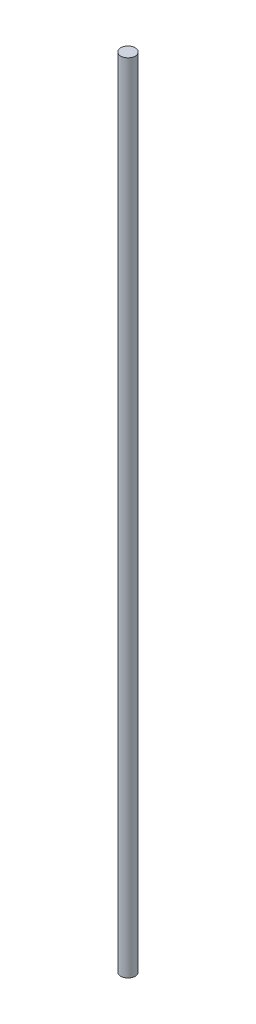
ISO-10303-21;
HEADER;
FILE_DESCRIPTION(('STEP AP214'),'2;1');
FILE_NAME('part.step','',(''),(''),'','','');
FILE_SCHEMA(('AUTOMOTIVE_DESIGN { 1 0 10303 214 1 1 1 1 }'));
ENDSEC;
DATA;
#1=APPLICATION_CONTEXT('core data for automotive mechanical design processes');
#2=APPLICATION_PROTOCOL_DEFINITION('international standard','automotive_design',2000,#1);
#3=PRODUCT_CONTEXT('',#1,'mechanical');
#4=PRODUCT('Part','Part','',(#3));
#5=PRODUCT_RELATED_PRODUCT_CATEGORY('part','',(#4));
#6=PRODUCT_DEFINITION_FORMATION('','',#4);
#7=PRODUCT_DEFINITION_CONTEXT('part definition',#1,'design');
#8=PRODUCT_DEFINITION('design','',#6,#7);
#9=PRODUCT_DEFINITION_SHAPE('','',#8);
#10=(LENGTH_UNIT() NAMED_UNIT(*) SI_UNIT(.MILLI.,.METRE.));
#11=(NAMED_UNIT(*) PLANE_ANGLE_UNIT() SI_UNIT($,.RADIAN.));
#12=(NAMED_UNIT(*) SI_UNIT($,.STERADIAN.) SOLID_ANGLE_UNIT());
#13=UNCERTAINTY_MEASURE_WITH_UNIT(LENGTH_MEASURE(1.E-05),#10,'distance_accuracy_value','');
#14=(GEOMETRIC_REPRESENTATION_CONTEXT(3) GLOBAL_UNCERTAINTY_ASSIGNED_CONTEXT((#13)) GLOBAL_UNIT_ASSIGNED_CONTEXT((#10,
#11,#12)) REPRESENTATION_CONTEXT('',''));
#15=CARTESIAN_POINT('',(0.,0.,0.));
#16=DIRECTION('',(0.,0.,1.));
#17=DIRECTION('',(1.,0.,0.));
#18=AXIS2_PLACEMENT_3D('',#15,#16,#17);
#19=CARTESIAN_POINT('',(0.,220.,0.));
#20=DIRECTION('',(0.,-1.,0.));
#21=DIRECTION('',(0.,0.,-1.));
#22=AXIS2_PLACEMENT_3D('',#19,#20,#21);
#23=CYLINDRICAL_SURFACE('',#22,2.);
#24=CARTESIAN_POINT('',(0.,220.,0.));
#25=DIRECTION('',(0.,1.,0.));
#26=DIRECTION('',(0.,0.,1.));
#27=AXIS2_PLACEMENT_3D('',#24,#25,#26);
#28=CIRCLE('',#27,2.);
#29=CARTESIAN_POINT('',(0.,220.,2.));
#30=VERTEX_POINT('',#29);
#31=EDGE_CURVE('E10',#30,#30,#28,.T.);
#32=ORIENTED_EDGE('',*,*,#31,.F.);
#33=EDGE_LOOP('',(#32));
#34=FACE_BOUND('',#33,.T.);
#35=CARTESIAN_POINT('',(0.,0.,0.));
#36=DIRECTION('',(0.,1.,0.));
#37=DIRECTION('',(0.,0.,1.));
#38=AXIS2_PLACEMENT_3D('',#35,#36,#37);
#39=CIRCLE('',#38,2.);
#40=CARTESIAN_POINT('',(0.,0.,2.));
#41=VERTEX_POINT('',#40);
#42=EDGE_CURVE('E44',#41,#41,#39,.T.);
#43=ORIENTED_EDGE('',*,*,#42,.T.);
#44=EDGE_LOOP('',(#43));
#45=FACE_BOUND('',#44,.T.);
#46=ADVANCED_FACE('F41',(#34,#45),#23,.T.);
#47=CARTESIAN_POINT('',(0.,220.,0.));
#48=DIRECTION('',(0.,1.,0.));
#49=DIRECTION('',(0.,0.,1.));
#50=AXIS2_PLACEMENT_3D('',#47,#48,#49);
#51=PLANE('',#50);
#52=ORIENTED_EDGE('',*,*,#31,.T.);
#53=EDGE_LOOP('',(#52));
#54=FACE_BOUND('',#53,.T.);
#55=ADVANCED_FACE('F58',(#54),#51,.T.);
#56=CARTESIAN_POINT('',(0.,0.,0.));
#57=DIRECTION('',(0.,1.,0.));
#58=DIRECTION('',(0.,0.,1.));
#59=AXIS2_PLACEMENT_3D('',#56,#57,#58);
#60=PLANE('',#59);
#61=ORIENTED_EDGE('',*,*,#42,.F.);
#62=EDGE_LOOP('',(#61));
#63=FACE_BOUND('',#62,.T.);
#64=ADVANCED_FACE('F56',(#63),#60,.F.);
#65=CLOSED_SHELL('',(#46,#55,#64));
#66=MANIFOLD_SOLID_BREP('B2',#65);
#67=ADVANCED_BREP_SHAPE_REPRESENTATION('',(#18,#66),#14);
#68=SHAPE_DEFINITION_REPRESENTATION(#9,#67);
ENDSEC;
END-ISO-10303-21;
